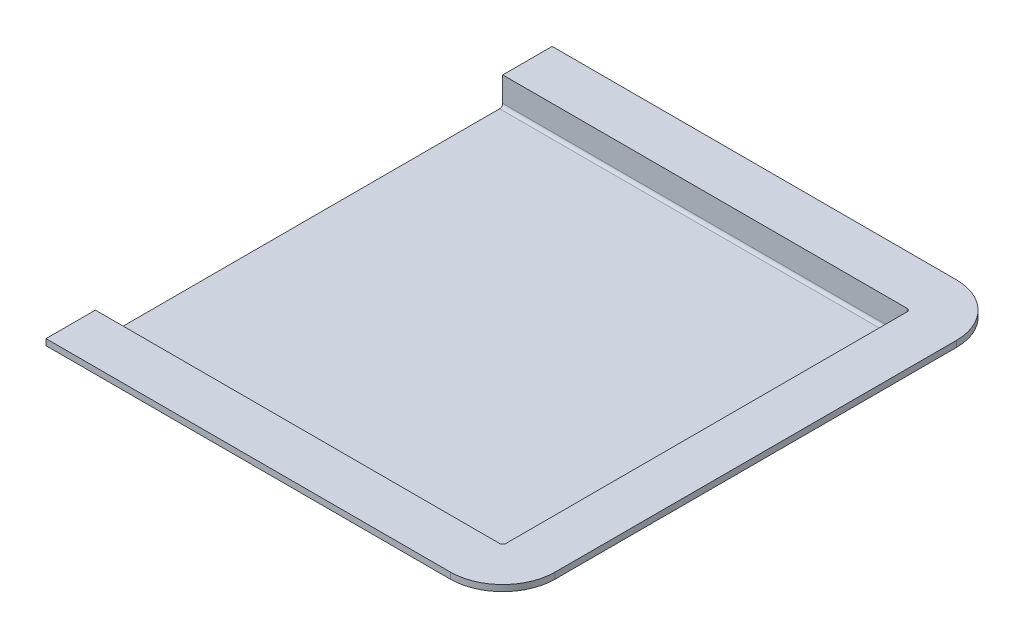
ISO-10303-21;
HEADER;
FILE_DESCRIPTION(('STEP AP214'),'2;1');
FILE_NAME('part.step','',(''),(''),'','','');
FILE_SCHEMA(('AUTOMOTIVE_DESIGN { 1 0 10303 214 1 1 1 1 }'));
ENDSEC;
DATA;
#1=APPLICATION_CONTEXT('core data for automotive mechanical design processes');
#2=APPLICATION_PROTOCOL_DEFINITION('international standard','automotive_design',2000,#1);
#3=PRODUCT_CONTEXT('',#1,'mechanical');
#4=PRODUCT('Part','Part','',(#3));
#5=PRODUCT_RELATED_PRODUCT_CATEGORY('part','',(#4));
#6=PRODUCT_DEFINITION_FORMATION('','',#4);
#7=PRODUCT_DEFINITION_CONTEXT('part definition',#1,'design');
#8=PRODUCT_DEFINITION('design','',#6,#7);
#9=PRODUCT_DEFINITION_SHAPE('','',#8);
#10=(LENGTH_UNIT() NAMED_UNIT(*) SI_UNIT(.MILLI.,.METRE.));
#11=(NAMED_UNIT(*) PLANE_ANGLE_UNIT() SI_UNIT($,.RADIAN.));
#12=(NAMED_UNIT(*) SI_UNIT($,.STERADIAN.) SOLID_ANGLE_UNIT());
#13=UNCERTAINTY_MEASURE_WITH_UNIT(LENGTH_MEASURE(1.E-05),#10,'distance_accuracy_value','');
#14=(GEOMETRIC_REPRESENTATION_CONTEXT(3) GLOBAL_UNCERTAINTY_ASSIGNED_CONTEXT((#13)) GLOBAL_UNIT_ASSIGNED_CONTEXT((#10,
#11,#12)) REPRESENTATION_CONTEXT('',''));
#15=CARTESIAN_POINT('',(0.,0.,0.));
#16=DIRECTION('',(0.,0.,1.));
#17=DIRECTION('',(1.,0.,0.));
#18=AXIS2_PLACEMENT_3D('',#15,#16,#17);
#19=CARTESIAN_POINT('',(-66.,9.,68.));
#20=DIRECTION('',(0.,0.,-1.));
#21=DIRECTION('',(-1.,0.,0.));
#22=AXIS2_PLACEMENT_3D('',#19,#20,#21);
#23=PLANE('',#22);
#24=DIRECTION('',(0.,-1.,0.));
#25=VECTOR('',#24,1.);
#26=CARTESIAN_POINT('',(65.,9.,68.));
#27=LINE('',#26,#25);
#28=CARTESIAN_POINT('',(65.,0.999999999999999,68.));
#29=VERTEX_POINT('',#28);
#30=CARTESIAN_POINT('',(65.,4.,68.));
#31=VERTEX_POINT('',#30);
#32=EDGE_CURVE('E351',#29,#31,#27,.F.);
#33=ORIENTED_EDGE('',*,*,#32,.T.);
#34=DIRECTION('',(-1.,0.,0.));
#35=VECTOR('',#34,1.);
#36=CARTESIAN_POINT('',(-66.,4.,68.));
#37=LINE('',#36,#35);
#38=CARTESIAN_POINT('',(-66.,4.,68.));
#39=VERTEX_POINT('',#38);
#40=EDGE_CURVE('E369',#31,#39,#37,.T.);
#41=ORIENTED_EDGE('',*,*,#40,.T.);
#42=DIRECTION('',(0.,-1.,0.));
#43=VECTOR('',#42,1.);
#44=CARTESIAN_POINT('',(-66.,9.,68.));
#45=LINE('',#44,#43);
#46=CARTESIAN_POINT('',(-66.,0.999999999999999,68.));
#47=VERTEX_POINT('',#46);
#48=EDGE_CURVE('E277',#39,#47,#45,.T.);
#49=ORIENTED_EDGE('',*,*,#48,.T.);
#50=DIRECTION('',(1.,0.,0.));
#51=VECTOR('',#50,1.);
#52=CARTESIAN_POINT('',(-66.,0.999999999999999,68.));
#53=LINE('',#52,#51);
#54=EDGE_CURVE('E349',#47,#29,#53,.T.);
#55=ORIENTED_EDGE('',*,*,#54,.T.);
#56=EDGE_LOOP('',(#33,#41,#49,#55));
#57=FACE_BOUND('',#56,.T.);
#58=ADVANCED_FACE('F39',(#57),#23,.F.);
#59=CARTESIAN_POINT('',(68.,9.,-66.));
#60=DIRECTION('',(-1.,0.,0.));
#61=DIRECTION('',(0.,0.,1.));
#62=AXIS2_PLACEMENT_3D('',#59,#60,#61);
#63=PLANE('',#62);
#64=DIRECTION('',(0.,-1.,0.));
#65=VECTOR('',#64,1.);
#66=CARTESIAN_POINT('',(68.,9.,-65.));
#67=LINE('',#66,#65);
#68=CARTESIAN_POINT('',(68.,0.999999999999999,-65.));
#69=VERTEX_POINT('',#68);
#70=CARTESIAN_POINT('',(68.,4.,-65.));
#71=VERTEX_POINT('',#70);
#72=EDGE_CURVE('E344',#69,#71,#67,.F.);
#73=ORIENTED_EDGE('',*,*,#72,.T.);
#74=DIRECTION('',(0.,0.,1.));
#75=VECTOR('',#74,1.);
#76=CARTESIAN_POINT('',(68.,4.,65.));
#77=LINE('',#76,#75);
#78=CARTESIAN_POINT('',(68.,4.,65.));
#79=VERTEX_POINT('',#78);
#80=EDGE_CURVE('E400',#71,#79,#77,.T.);
#81=ORIENTED_EDGE('',*,*,#80,.T.);
#82=DIRECTION('',(0.,-1.,0.));
#83=VECTOR('',#82,1.);
#84=CARTESIAN_POINT('',(68.,9.,65.));
#85=LINE('',#84,#83);
#86=CARTESIAN_POINT('',(68.,0.999999999999999,65.));
#87=VERTEX_POINT('',#86);
#88=EDGE_CURVE('E347',#79,#87,#85,.T.);
#89=ORIENTED_EDGE('',*,*,#88,.T.);
#90=DIRECTION('',(0.,0.,-1.));
#91=VECTOR('',#90,1.);
#92=CARTESIAN_POINT('',(68.,0.999999999999999,-66.));
#93=LINE('',#92,#91);
#94=EDGE_CURVE('E325',#87,#69,#93,.T.);
#95=ORIENTED_EDGE('',*,*,#94,.T.);
#96=EDGE_LOOP('',(#73,#81,#89,#95));
#97=FACE_BOUND('',#96,.T.);
#98=ADVANCED_FACE('F501',(#97),#63,.F.);
#99=CARTESIAN_POINT('',(-66.,9.,-68.));
#100=DIRECTION('',(0.,0.,1.));
#101=DIRECTION('',(1.,0.,0.));
#102=AXIS2_PLACEMENT_3D('',#99,#100,#101);
#103=PLANE('',#102);
#104=DIRECTION('',(0.,1.,0.));
#105=VECTOR('',#104,1.);
#106=CARTESIAN_POINT('',(-66.,9.,-68.));
#107=LINE('',#106,#105);
#108=CARTESIAN_POINT('',(-66.,0.999999999999999,-68.));
#109=VERTEX_POINT('',#108);
#110=CARTESIAN_POINT('',(-66.,4.,-68.));
#111=VERTEX_POINT('',#110);
#112=EDGE_CURVE('E270',#109,#111,#107,.T.);
#113=ORIENTED_EDGE('',*,*,#112,.T.);
#114=DIRECTION('',(1.,0.,0.));
#115=VECTOR('',#114,1.);
#116=CARTESIAN_POINT('',(65.,4.,-68.));
#117=LINE('',#116,#115);
#118=CARTESIAN_POINT('',(65.,4.,-68.));
#119=VERTEX_POINT('',#118);
#120=EDGE_CURVE('E61',#111,#119,#117,.T.);
#121=ORIENTED_EDGE('',*,*,#120,.T.);
#122=DIRECTION('',(0.,-1.,0.));
#123=VECTOR('',#122,1.);
#124=CARTESIAN_POINT('',(65.,9.,-68.));
#125=LINE('',#124,#123);
#126=CARTESIAN_POINT('',(65.,0.999999999999999,-68.));
#127=VERTEX_POINT('',#126);
#128=EDGE_CURVE('E356',#119,#127,#125,.T.);
#129=ORIENTED_EDGE('',*,*,#128,.T.);
#130=DIRECTION('',(-1.,0.,0.));
#131=VECTOR('',#130,1.);
#132=CARTESIAN_POINT('',(-66.,0.999999999999999,-68.));
#133=LINE('',#132,#131);
#134=EDGE_CURVE('E354',#127,#109,#133,.T.);
#135=ORIENTED_EDGE('',*,*,#134,.T.);
#136=EDGE_LOOP('',(#113,#121,#129,#135));
#137=FACE_BOUND('',#136,.T.);
#138=ADVANCED_FACE('F507',(#137),#103,.F.);
#139=CARTESIAN_POINT('',(65.,9.,-65.));
#140=DIRECTION('',(0.,-1.,0.));
#141=DIRECTION('',(0.,0.,-1.));
#142=AXIS2_PLACEMENT_3D('',#139,#140,#141);
#143=CYLINDRICAL_SURFACE('',#142,3.);
#144=ORIENTED_EDGE('',*,*,#128,.F.);
#145=CARTESIAN_POINT('',(65.,4.,-65.));
#146=DIRECTION('',(0.,1.,0.));
#147=DIRECTION('',(0.,0.,1.));
#148=AXIS2_PLACEMENT_3D('',#145,#146,#147);
#149=CIRCLE('',#148,3.);
#150=EDGE_CURVE('E402',#119,#71,#149,.F.);
#151=ORIENTED_EDGE('',*,*,#150,.T.);
#152=ORIENTED_EDGE('',*,*,#72,.F.);
#153=CARTESIAN_POINT('',(65.,0.999999999999999,-65.));
#154=DIRECTION('',(0.,-1.,0.));
#155=DIRECTION('',(0.,0.,-1.));
#156=AXIS2_PLACEMENT_3D('',#153,#154,#155);
#157=CIRCLE('',#156,3.);
#158=EDGE_CURVE('E329',#127,#69,#157,.T.);
#159=ORIENTED_EDGE('',*,*,#158,.F.);
#160=EDGE_LOOP('',(#144,#151,#152,#159));
#161=FACE_BOUND('',#160,.T.);
#162=ADVANCED_FACE('F515',(#161),#143,.T.);
#163=CARTESIAN_POINT('',(65.,9.,65.));
#164=DIRECTION('',(0.,-1.,0.));
#165=DIRECTION('',(0.,0.,-1.));
#166=AXIS2_PLACEMENT_3D('',#163,#164,#165);
#167=CYLINDRICAL_SURFACE('',#166,3.);
#168=ORIENTED_EDGE('',*,*,#88,.F.);
#169=CARTESIAN_POINT('',(65.,4.,65.));
#170=DIRECTION('',(0.,1.,0.));
#171=DIRECTION('',(0.,0.,1.));
#172=AXIS2_PLACEMENT_3D('',#169,#170,#171);
#173=CIRCLE('',#172,3.);
#174=EDGE_CURVE('E398',#79,#31,#173,.F.);
#175=ORIENTED_EDGE('',*,*,#174,.T.);
#176=ORIENTED_EDGE('',*,*,#32,.F.);
#177=CARTESIAN_POINT('',(65.,0.999999999999999,65.));
#178=DIRECTION('',(0.,-1.,0.));
#179=DIRECTION('',(0.,0.,-1.));
#180=AXIS2_PLACEMENT_3D('',#177,#178,#179);
#181=CIRCLE('',#180,3.);
#182=EDGE_CURVE('E260',#29,#87,#181,.F.);
#183=ORIENTED_EDGE('',*,*,#182,.T.);
#184=EDGE_LOOP('',(#168,#175,#176,#183));
#185=FACE_BOUND('',#184,.T.);
#186=ADVANCED_FACE('F523',(#185),#167,.T.);
#187=CARTESIAN_POINT('',(0.,9.,0.));
#188=DIRECTION('',(0.,1.,0.));
#189=DIRECTION('',(0.,0.,1.));
#190=AXIS2_PLACEMENT_3D('',#187,#188,#189);
#191=PLANE('',#190);
#192=DIRECTION('',(-1.,0.,0.));
#193=VECTOR('',#192,1.);
#194=CARTESIAN_POINT('',(65.,9.,-82.));
#195=LINE('',#194,#193);
#196=CARTESIAN_POINT('',(65.,9.,-82.));
#197=VERTEX_POINT('',#196);
#198=CARTESIAN_POINT('',(-66.,9.,-82.));
#199=VERTEX_POINT('',#198);
#200=EDGE_CURVE('E217',#197,#199,#195,.T.);
#201=ORIENTED_EDGE('',*,*,#200,.T.);
#202=DIRECTION('',(0.,0.,-1.));
#203=VECTOR('',#202,1.);
#204=CARTESIAN_POINT('',(-66.,9.,0.));
#205=LINE('',#204,#203);
#206=CARTESIAN_POINT('',(-66.,9.,-66.));
#207=VERTEX_POINT('',#206);
#208=EDGE_CURVE('E268',#207,#199,#205,.T.);
#209=ORIENTED_EDGE('',*,*,#208,.F.);
#210=DIRECTION('',(-1.,0.,0.));
#211=VECTOR('',#210,1.);
#212=CARTESIAN_POINT('',(-66.,9.,-66.));
#213=LINE('',#212,#211);
#214=CARTESIAN_POINT('',(65.,9.,-66.));
#215=VERTEX_POINT('',#214);
#216=EDGE_CURVE('E286',#215,#207,#213,.T.);
#217=ORIENTED_EDGE('',*,*,#216,.F.);
#218=CARTESIAN_POINT('',(65.,9.,-65.));
#219=DIRECTION('',(0.,1.,0.));
#220=DIRECTION('',(0.,0.,1.));
#221=AXIS2_PLACEMENT_3D('',#218,#219,#220);
#222=CIRCLE('',#221,1.);
#223=CARTESIAN_POINT('',(66.,9.,-65.));
#224=VERTEX_POINT('',#223);
#225=EDGE_CURVE('E319',#215,#224,#222,.F.);
#226=ORIENTED_EDGE('',*,*,#225,.T.);
#227=DIRECTION('',(0.,0.,-1.));
#228=VECTOR('',#227,1.);
#229=CARTESIAN_POINT('',(66.,9.,-66.));
#230=LINE('',#229,#228);
#231=CARTESIAN_POINT('',(66.,9.,65.));
#232=VERTEX_POINT('',#231);
#233=EDGE_CURVE('E282',#232,#224,#230,.T.);
#234=ORIENTED_EDGE('',*,*,#233,.F.);
#235=CARTESIAN_POINT('',(65.,9.,65.));
#236=DIRECTION('',(0.,1.,0.));
#237=DIRECTION('',(0.,0.,1.));
#238=AXIS2_PLACEMENT_3D('',#235,#236,#237);
#239=CIRCLE('',#238,1.);
#240=CARTESIAN_POINT('',(65.,9.,66.));
#241=VERTEX_POINT('',#240);
#242=EDGE_CURVE('E317',#232,#241,#239,.F.);
#243=ORIENTED_EDGE('',*,*,#242,.T.);
#244=DIRECTION('',(1.,0.,0.));
#245=VECTOR('',#244,1.);
#246=CARTESIAN_POINT('',(-66.,9.,66.));
#247=LINE('',#246,#245);
#248=CARTESIAN_POINT('',(-66.,9.,66.));
#249=VERTEX_POINT('',#248);
#250=EDGE_CURVE('E279',#249,#241,#247,.T.);
#251=ORIENTED_EDGE('',*,*,#250,.F.);
#252=CARTESIAN_POINT('',(-66.,9.,82.));
#253=VERTEX_POINT('',#252);
#254=EDGE_CURVE('E272',#253,#249,#205,.T.);
#255=ORIENTED_EDGE('',*,*,#254,.F.);
#256=DIRECTION('',(1.,0.,0.));
#257=VECTOR('',#256,1.);
#258=CARTESIAN_POINT('',(-66.,9.,82.));
#259=LINE('',#258,#257);
#260=CARTESIAN_POINT('',(65.,9.,82.));
#261=VERTEX_POINT('',#260);
#262=EDGE_CURVE('E223',#253,#261,#259,.T.);
#263=ORIENTED_EDGE('',*,*,#262,.T.);
#264=CARTESIAN_POINT('',(65.,9.,65.));
#265=DIRECTION('',(0.,1.,0.));
#266=DIRECTION('',(0.,0.,1.));
#267=AXIS2_PLACEMENT_3D('',#264,#265,#266);
#268=CIRCLE('',#267,17.);
#269=CARTESIAN_POINT('',(82.,9.,65.));
#270=VERTEX_POINT('',#269);
#271=EDGE_CURVE('E246',#261,#270,#268,.T.);
#272=ORIENTED_EDGE('',*,*,#271,.T.);
#273=DIRECTION('',(0.,0.,-1.));
#274=VECTOR('',#273,1.);
#275=CARTESIAN_POINT('',(82.,9.,65.));
#276=LINE('',#275,#274);
#277=CARTESIAN_POINT('',(82.,9.,-65.));
#278=VERTEX_POINT('',#277);
#279=EDGE_CURVE('E249',#270,#278,#276,.T.);
#280=ORIENTED_EDGE('',*,*,#279,.T.);
#281=CARTESIAN_POINT('',(65.,9.,-65.));
#282=DIRECTION('',(0.,1.,0.));
#283=DIRECTION('',(0.,0.,1.));
#284=AXIS2_PLACEMENT_3D('',#281,#282,#283);
#285=CIRCLE('',#284,17.);
#286=EDGE_CURVE('E252',#278,#197,#285,.T.);
#287=ORIENTED_EDGE('',*,*,#286,.T.);
#288=EDGE_LOOP('',(#201,#209,#217,#226,#234,#243,#251,#255,#263,#272,#280,#287));
#289=FACE_BOUND('',#288,.T.);
#290=ADVANCED_FACE('F433',(#289),#191,.T.);
#291=CARTESIAN_POINT('',(0.,-2.,0.));
#292=DIRECTION('',(0.,1.,0.));
#293=DIRECTION('',(0.,0.,1.));
#294=AXIS2_PLACEMENT_3D('',#291,#292,#293);
#295=PLANE('',#294);
#296=DIRECTION('',(0.,0.,-1.));
#297=VECTOR('',#296,1.);
#298=CARTESIAN_POINT('',(-66.,-2.,0.));
#299=LINE('',#298,#297);
#300=CARTESIAN_POINT('',(-66.,-2.,65.));
#301=VERTEX_POINT('',#300);
#302=CARTESIAN_POINT('',(-66.,-2.,-65.));
#303=VERTEX_POINT('',#302);
#304=EDGE_CURVE('E274',#301,#303,#299,.T.);
#305=ORIENTED_EDGE('',*,*,#304,.T.);
#306=DIRECTION('',(-1.,0.,0.));
#307=VECTOR('',#306,1.);
#308=CARTESIAN_POINT('',(0.,-2.,-65.));
#309=LINE('',#308,#307);
#310=CARTESIAN_POINT('',(65.,-2.,-65.));
#311=VERTEX_POINT('',#310);
#312=EDGE_CURVE('E367',#303,#311,#309,.F.);
#313=ORIENTED_EDGE('',*,*,#312,.T.);
#314=DIRECTION('',(0.,0.,-1.));
#315=VECTOR('',#314,1.);
#316=CARTESIAN_POINT('',(65.,-2.,0.));
#317=LINE('',#316,#315);
#318=CARTESIAN_POINT('',(65.,-2.,65.));
#319=VERTEX_POINT('',#318);
#320=EDGE_CURVE('E365',#311,#319,#317,.F.);
#321=ORIENTED_EDGE('',*,*,#320,.T.);
#322=DIRECTION('',(1.,0.,0.));
#323=VECTOR('',#322,1.);
#324=CARTESIAN_POINT('',(0.,-2.,65.));
#325=LINE('',#324,#323);
#326=EDGE_CURVE('E363',#319,#301,#325,.F.);
#327=ORIENTED_EDGE('',*,*,#326,.T.);
#328=EDGE_LOOP('',(#305,#313,#321,#327));
#329=FACE_BOUND('',#328,.T.);
#330=ADVANCED_FACE('F516',(#329),#295,.F.);
#331=CARTESIAN_POINT('',(-66.,9.,66.));
#332=DIRECTION('',(0.,0.,-1.));
#333=DIRECTION('',(-1.,0.,0.));
#334=AXIS2_PLACEMENT_3D('',#331,#332,#333);
#335=PLANE('',#334);
#336=ORIENTED_EDGE('',*,*,#250,.T.);
#337=DIRECTION('',(0.,-1.,0.));
#338=VECTOR('',#337,1.);
#339=CARTESIAN_POINT('',(65.,0.,66.));
#340=LINE('',#339,#338);
#341=CARTESIAN_POINT('',(65.,1.,66.));
#342=VERTEX_POINT('',#341);
#343=EDGE_CURVE('E298',#241,#342,#340,.T.);
#344=ORIENTED_EDGE('',*,*,#343,.T.);
#345=DIRECTION('',(1.,0.,0.));
#346=VECTOR('',#345,1.);
#347=CARTESIAN_POINT('',(-66.,1.,66.));
#348=LINE('',#347,#346);
#349=CARTESIAN_POINT('',(-66.,0.999999999999999,66.));
#350=VERTEX_POINT('',#349);
#351=EDGE_CURVE('E296',#342,#350,#348,.F.);
#352=ORIENTED_EDGE('',*,*,#351,.T.);
#353=DIRECTION('',(0.,-1.,0.));
#354=VECTOR('',#353,1.);
#355=CARTESIAN_POINT('',(-66.,9.,66.));
#356=LINE('',#355,#354);
#357=EDGE_CURVE('E293',#249,#350,#356,.T.);
#358=ORIENTED_EDGE('',*,*,#357,.F.);
#359=EDGE_LOOP('',(#336,#344,#352,#358));
#360=FACE_BOUND('',#359,.T.);
#361=ADVANCED_FACE('F449',(#360),#335,.T.);
#362=CARTESIAN_POINT('',(66.,9.,-66.));
#363=DIRECTION('',(-1.,0.,0.));
#364=DIRECTION('',(0.,0.,1.));
#365=AXIS2_PLACEMENT_3D('',#362,#363,#364);
#366=PLANE('',#365);
#367=DIRECTION('',(0.,0.,-1.));
#368=VECTOR('',#367,1.);
#369=CARTESIAN_POINT('',(66.,1.,66.));
#370=LINE('',#369,#368);
#371=CARTESIAN_POINT('',(66.,1.,-65.));
#372=VERTEX_POINT('',#371);
#373=CARTESIAN_POINT('',(66.,1.,65.));
#374=VERTEX_POINT('',#373);
#375=EDGE_CURVE('E301',#372,#374,#370,.F.);
#376=ORIENTED_EDGE('',*,*,#375,.T.);
#377=DIRECTION('',(0.,-1.,0.));
#378=VECTOR('',#377,1.);
#379=CARTESIAN_POINT('',(66.,9.,65.));
#380=LINE('',#379,#378);
#381=EDGE_CURVE('E305',#374,#232,#380,.F.);
#382=ORIENTED_EDGE('',*,*,#381,.T.);
#383=ORIENTED_EDGE('',*,*,#233,.T.);
#384=DIRECTION('',(0.,-1.,0.));
#385=VECTOR('',#384,1.);
#386=CARTESIAN_POINT('',(66.,0.,-65.));
#387=LINE('',#386,#385);
#388=EDGE_CURVE('E303',#224,#372,#387,.T.);
#389=ORIENTED_EDGE('',*,*,#388,.T.);
#390=EDGE_LOOP('',(#376,#382,#383,#389));
#391=FACE_BOUND('',#390,.T.);
#392=ADVANCED_FACE('F476',(#391),#366,.T.);
#393=CARTESIAN_POINT('',(-66.,9.,-66.));
#394=DIRECTION('',(0.,0.,1.));
#395=DIRECTION('',(1.,0.,0.));
#396=AXIS2_PLACEMENT_3D('',#393,#394,#395);
#397=PLANE('',#396);
#398=DIRECTION('',(-1.,0.,0.));
#399=VECTOR('',#398,1.);
#400=CARTESIAN_POINT('',(66.,1.,-66.));
#401=LINE('',#400,#399);
#402=CARTESIAN_POINT('',(-66.,0.999999999999999,-66.));
#403=VERTEX_POINT('',#402);
#404=CARTESIAN_POINT('',(65.,1.,-66.));
#405=VERTEX_POINT('',#404);
#406=EDGE_CURVE('E307',#403,#405,#401,.F.);
#407=ORIENTED_EDGE('',*,*,#406,.T.);
#408=DIRECTION('',(0.,-1.,0.));
#409=VECTOR('',#408,1.);
#410=CARTESIAN_POINT('',(65.,9.,-66.));
#411=LINE('',#410,#409);
#412=EDGE_CURVE('E309',#405,#215,#411,.F.);
#413=ORIENTED_EDGE('',*,*,#412,.T.);
#414=ORIENTED_EDGE('',*,*,#216,.T.);
#415=DIRECTION('',(0.,-1.,0.));
#416=VECTOR('',#415,1.);
#417=CARTESIAN_POINT('',(-66.,9.,-66.));
#418=LINE('',#417,#416);
#419=EDGE_CURVE('E288',#207,#403,#418,.T.);
#420=ORIENTED_EDGE('',*,*,#419,.T.);
#421=EDGE_LOOP('',(#407,#413,#414,#420));
#422=FACE_BOUND('',#421,.T.);
#423=ADVANCED_FACE('F484',(#422),#397,.T.);
#424=CARTESIAN_POINT('',(0.,0.,0.));
#425=DIRECTION('',(0.,1.,0.));
#426=DIRECTION('',(0.,0.,1.));
#427=AXIS2_PLACEMENT_3D('',#424,#425,#426);
#428=PLANE('',#427);
#429=DIRECTION('',(0.,0.,1.));
#430=VECTOR('',#429,1.);
#431=CARTESIAN_POINT('',(-66.,0.,-66.));
#432=LINE('',#431,#430);
#433=CARTESIAN_POINT('',(-66.,0.,-65.));
#434=VERTEX_POINT('',#433);
#435=CARTESIAN_POINT('',(-66.,0.,65.));
#436=VERTEX_POINT('',#435);
#437=EDGE_CURVE('E283',#434,#436,#432,.T.);
#438=ORIENTED_EDGE('',*,*,#437,.T.);
#439=DIRECTION('',(1.,0.,0.));
#440=VECTOR('',#439,1.);
#441=CARTESIAN_POINT('',(66.,0.,65.));
#442=LINE('',#441,#440);
#443=CARTESIAN_POINT('',(65.,0.,65.));
#444=VERTEX_POINT('',#443);
#445=EDGE_CURVE('E315',#436,#444,#442,.T.);
#446=ORIENTED_EDGE('',*,*,#445,.T.);
#447=DIRECTION('',(0.,0.,-1.));
#448=VECTOR('',#447,1.);
#449=CARTESIAN_POINT('',(65.,0.,-66.));
#450=LINE('',#449,#448);
#451=CARTESIAN_POINT('',(65.,0.,-65.));
#452=VERTEX_POINT('',#451);
#453=EDGE_CURVE('E313',#444,#452,#450,.T.);
#454=ORIENTED_EDGE('',*,*,#453,.T.);
#455=DIRECTION('',(-1.,0.,0.));
#456=VECTOR('',#455,1.);
#457=CARTESIAN_POINT('',(-66.,0.,-65.));
#458=LINE('',#457,#456);
#459=EDGE_CURVE('E311',#452,#434,#458,.T.);
#460=ORIENTED_EDGE('',*,*,#459,.T.);
#461=EDGE_LOOP('',(#438,#446,#454,#460));
#462=FACE_BOUND('',#461,.T.);
#463=ADVANCED_FACE('F459',(#462),#428,.T.);
#464=CARTESIAN_POINT('',(-66.,9.,-66.));
#465=DIRECTION('',(1.,0.,0.));
#466=DIRECTION('',(0.,0.,-1.));
#467=AXIS2_PLACEMENT_3D('',#464,#465,#466);
#468=PLANE('',#467);
#469=ORIENTED_EDGE('',*,*,#112,.F.);
#470=CARTESIAN_POINT('',(-66.,0.999999999999999,-65.));
#471=DIRECTION('',(1.,0.,0.));
#472=DIRECTION('',(0.,0.,-1.));
#473=AXIS2_PLACEMENT_3D('',#470,#471,#472);
#474=CIRCLE('',#473,3.);
#475=EDGE_CURVE('E361',#109,#303,#474,.F.);
#476=ORIENTED_EDGE('',*,*,#475,.T.);
#477=ORIENTED_EDGE('',*,*,#304,.F.);
#478=CARTESIAN_POINT('',(-66.,0.999999999999999,65.));
#479=DIRECTION('',(1.,0.,0.));
#480=DIRECTION('',(0.,0.,-1.));
#481=AXIS2_PLACEMENT_3D('',#478,#479,#480);
#482=CIRCLE('',#481,3.);
#483=EDGE_CURVE('E358',#301,#47,#482,.F.);
#484=ORIENTED_EDGE('',*,*,#483,.T.);
#485=ORIENTED_EDGE('',*,*,#48,.F.);
#486=CARTESIAN_POINT('',(-66.,4.,71.));
#487=DIRECTION('',(1.,0.,0.));
#488=DIRECTION('',(0.,0.,-1.));
#489=AXIS2_PLACEMENT_3D('',#486,#487,#488);
#490=CIRCLE('',#489,3.);
#491=CARTESIAN_POINT('',(-66.,7.,71.));
#492=VERTEX_POINT('',#491);
#493=EDGE_CURVE('E48',#39,#492,#490,.T.);
#494=ORIENTED_EDGE('',*,*,#493,.T.);
#495=DIRECTION('',(0.,0.,1.));
#496=VECTOR('',#495,1.);
#497=CARTESIAN_POINT('',(-66.,7.,82.));
#498=LINE('',#497,#496);
#499=CARTESIAN_POINT('',(-66.,7.,82.));
#500=VERTEX_POINT('',#499);
#501=EDGE_CURVE('E207',#492,#500,#498,.T.);
#502=ORIENTED_EDGE('',*,*,#501,.T.);
#503=DIRECTION('',(0.,1.,0.));
#504=VECTOR('',#503,1.);
#505=CARTESIAN_POINT('',(-66.,7.,82.));
#506=LINE('',#505,#504);
#507=EDGE_CURVE('E210',#500,#253,#506,.T.);
#508=ORIENTED_EDGE('',*,*,#507,.T.);
#509=ORIENTED_EDGE('',*,*,#254,.T.);
#510=ORIENTED_EDGE('',*,*,#357,.T.);
#511=CARTESIAN_POINT('',(-66.,1.,65.));
#512=DIRECTION('',(1.,0.,0.));
#513=DIRECTION('',(0.,0.,-1.));
#514=AXIS2_PLACEMENT_3D('',#511,#512,#513);
#515=CIRCLE('',#514,1.);
#516=EDGE_CURVE('E321',#350,#436,#515,.T.);
#517=ORIENTED_EDGE('',*,*,#516,.T.);
#518=ORIENTED_EDGE('',*,*,#437,.F.);
#519=CARTESIAN_POINT('',(-66.,1.,-65.));
#520=DIRECTION('',(1.,0.,0.));
#521=DIRECTION('',(0.,0.,-1.));
#522=AXIS2_PLACEMENT_3D('',#519,#520,#521);
#523=CIRCLE('',#522,1.);
#524=EDGE_CURVE('E323',#434,#403,#523,.T.);
#525=ORIENTED_EDGE('',*,*,#524,.T.);
#526=ORIENTED_EDGE('',*,*,#419,.F.);
#527=ORIENTED_EDGE('',*,*,#208,.T.);
#528=DIRECTION('',(0.,1.,0.));
#529=VECTOR('',#528,1.);
#530=CARTESIAN_POINT('',(-66.,7.,-82.));
#531=LINE('',#530,#529);
#532=CARTESIAN_POINT('',(-66.,7.,-82.));
#533=VERTEX_POINT('',#532);
#534=EDGE_CURVE('E257',#533,#199,#531,.T.);
#535=ORIENTED_EDGE('',*,*,#534,.F.);
#536=DIRECTION('',(0.,0.,1.));
#537=VECTOR('',#536,1.);
#538=CARTESIAN_POINT('',(-66.,7.,-82.));
#539=LINE('',#538,#537);
#540=CARTESIAN_POINT('',(-66.,7.,-71.));
#541=VERTEX_POINT('',#540);
#542=EDGE_CURVE('E225',#533,#541,#539,.T.);
#543=ORIENTED_EDGE('',*,*,#542,.T.);
#544=CARTESIAN_POINT('',(-66.,4.,-71.));
#545=DIRECTION('',(1.,0.,0.));
#546=DIRECTION('',(0.,0.,-1.));
#547=AXIS2_PLACEMENT_3D('',#544,#545,#546);
#548=CIRCLE('',#547,3.);
#549=EDGE_CURVE('E11',#541,#111,#548,.T.);
#550=ORIENTED_EDGE('',*,*,#549,.T.);
#551=EDGE_LOOP('',(#469,#476,#477,#484,#485,#494,#502,#508,#509,#510,#517,#518,#525,#526,#527,
#535,#543,#550));
#552=FACE_BOUND('',#551,.T.);
#553=ADVANCED_FACE('F209',(#552),#468,.F.);
#554=CARTESIAN_POINT('',(0.,1.,-65.));
#555=DIRECTION('',(1.,0.,0.));
#556=DIRECTION('',(0.,0.,-1.));
#557=AXIS2_PLACEMENT_3D('',#554,#555,#556);
#558=CYLINDRICAL_SURFACE('',#557,1.);
#559=ORIENTED_EDGE('',*,*,#524,.F.);
#560=ORIENTED_EDGE('',*,*,#459,.F.);
#561=CARTESIAN_POINT('',(65.,1.,-65.));
#562=DIRECTION('',(-1.,0.,0.));
#563=DIRECTION('',(0.,0.,1.));
#564=AXIS2_PLACEMENT_3D('',#561,#562,#563);
#565=CIRCLE('',#564,1.);
#566=EDGE_CURVE('E271',#405,#452,#565,.T.);
#567=ORIENTED_EDGE('',*,*,#566,.F.);
#568=ORIENTED_EDGE('',*,*,#406,.F.);
#569=EDGE_LOOP('',(#559,#560,#567,#568));
#570=FACE_BOUND('',#569,.T.);
#571=ADVANCED_FACE('F464',(#570),#558,.F.);
#572=CARTESIAN_POINT('',(65.,9.,-65.));
#573=DIRECTION('',(0.,1.,0.));
#574=DIRECTION('',(0.,0.,1.));
#575=AXIS2_PLACEMENT_3D('',#572,#573,#574);
#576=CYLINDRICAL_SURFACE('',#575,1.);
#577=ORIENTED_EDGE('',*,*,#225,.F.);
#578=ORIENTED_EDGE('',*,*,#412,.F.);
#579=CARTESIAN_POINT('',(65.,1.,-65.));
#580=DIRECTION('',(0.,1.,0.));
#581=DIRECTION('',(0.,0.,1.));
#582=AXIS2_PLACEMENT_3D('',#579,#580,#581);
#583=CIRCLE('',#582,1.);
#584=EDGE_CURVE('E338',#372,#405,#583,.T.);
#585=ORIENTED_EDGE('',*,*,#584,.F.);
#586=ORIENTED_EDGE('',*,*,#388,.F.);
#587=EDGE_LOOP('',(#577,#578,#585,#586));
#588=FACE_BOUND('',#587,.T.);
#589=ADVANCED_FACE('F482',(#588),#576,.F.);
#590=CARTESIAN_POINT('',(65.,1.,-65.));
#591=DIRECTION('',(0.,0.,-1.));
#592=DIRECTION('',(-1.,0.,0.));
#593=AXIS2_PLACEMENT_3D('',#590,#591,#592);
#594=SPHERICAL_SURFACE('',#593,1.);
#595=ORIENTED_EDGE('',*,*,#584,.T.);
#596=ORIENTED_EDGE('',*,*,#566,.T.);
#597=CARTESIAN_POINT('',(65.,1.,-65.));
#598=DIRECTION('',(0.,0.,1.));
#599=DIRECTION('',(1.,0.,0.));
#600=AXIS2_PLACEMENT_3D('',#597,#598,#599);
#601=CIRCLE('',#600,1.);
#602=EDGE_CURVE('E335',#372,#452,#601,.F.);
#603=ORIENTED_EDGE('',*,*,#602,.F.);
#604=EDGE_LOOP('',(#595,#596,#603));
#605=FACE_BOUND('',#604,.T.);
#606=ADVANCED_FACE('F468',(#605),#594,.F.);
#607=CARTESIAN_POINT('',(0.,1.,65.));
#608=DIRECTION('',(-1.,0.,0.));
#609=DIRECTION('',(0.,0.,1.));
#610=AXIS2_PLACEMENT_3D('',#607,#608,#609);
#611=CYLINDRICAL_SURFACE('',#610,1.);
#612=ORIENTED_EDGE('',*,*,#516,.F.);
#613=ORIENTED_EDGE('',*,*,#351,.F.);
#614=CARTESIAN_POINT('',(65.,1.,65.));
#615=DIRECTION('',(-1.,0.,0.));
#616=DIRECTION('',(0.,0.,1.));
#617=AXIS2_PLACEMENT_3D('',#614,#615,#616);
#618=CIRCLE('',#617,1.);
#619=EDGE_CURVE('E332',#444,#342,#618,.T.);
#620=ORIENTED_EDGE('',*,*,#619,.F.);
#621=ORIENTED_EDGE('',*,*,#445,.F.);
#622=EDGE_LOOP('',(#612,#613,#620,#621));
#623=FACE_BOUND('',#622,.T.);
#624=ADVANCED_FACE('F454',(#623),#611,.F.);
#625=CARTESIAN_POINT('',(65.,1.,0.));
#626=DIRECTION('',(0.,0.,1.));
#627=DIRECTION('',(1.,0.,0.));
#628=AXIS2_PLACEMENT_3D('',#625,#626,#627);
#629=CYLINDRICAL_SURFACE('',#628,1.);
#630=ORIENTED_EDGE('',*,*,#602,.T.);
#631=ORIENTED_EDGE('',*,*,#453,.F.);
#632=CARTESIAN_POINT('',(65.,1.,65.));
#633=DIRECTION('',(0.,0.,-1.));
#634=DIRECTION('',(-1.,0.,0.));
#635=AXIS2_PLACEMENT_3D('',#632,#633,#634);
#636=CIRCLE('',#635,1.);
#637=EDGE_CURVE('E328',#374,#444,#636,.T.);
#638=ORIENTED_EDGE('',*,*,#637,.F.);
#639=ORIENTED_EDGE('',*,*,#375,.F.);
#640=EDGE_LOOP('',(#630,#631,#638,#639));
#641=FACE_BOUND('',#640,.T.);
#642=ADVANCED_FACE('F472',(#641),#629,.F.);
#643=CARTESIAN_POINT('',(65.,1.,65.));
#644=DIRECTION('',(0.,-1.,0.));
#645=DIRECTION('',(0.,0.,-1.));
#646=AXIS2_PLACEMENT_3D('',#643,#644,#645);
#647=SPHERICAL_SURFACE('',#646,1.);
#648=ORIENTED_EDGE('',*,*,#637,.T.);
#649=ORIENTED_EDGE('',*,*,#619,.T.);
#650=CARTESIAN_POINT('',(65.,1.,65.));
#651=DIRECTION('',(0.,1.,0.));
#652=DIRECTION('',(0.,0.,1.));
#653=AXIS2_PLACEMENT_3D('',#650,#651,#652);
#654=CIRCLE('',#653,1.);
#655=EDGE_CURVE('E326',#374,#342,#654,.F.);
#656=ORIENTED_EDGE('',*,*,#655,.F.);
#657=EDGE_LOOP('',(#648,#649,#656));
#658=FACE_BOUND('',#657,.T.);
#659=ADVANCED_FACE('F490',(#658),#647,.F.);
#660=CARTESIAN_POINT('',(65.,9.,65.));
#661=DIRECTION('',(0.,1.,0.));
#662=DIRECTION('',(0.,0.,1.));
#663=AXIS2_PLACEMENT_3D('',#660,#661,#662);
#664=CYLINDRICAL_SURFACE('',#663,1.);
#665=ORIENTED_EDGE('',*,*,#242,.F.);
#666=ORIENTED_EDGE('',*,*,#381,.F.);
#667=ORIENTED_EDGE('',*,*,#655,.T.);
#668=ORIENTED_EDGE('',*,*,#343,.F.);
#669=EDGE_LOOP('',(#665,#666,#667,#668));
#670=FACE_BOUND('',#669,.T.);
#671=ADVANCED_FACE('F487',(#670),#664,.F.);
#672=CARTESIAN_POINT('',(-66.,0.999999999999999,-65.));
#673=DIRECTION('',(-1.,0.,0.));
#674=DIRECTION('',(0.,0.,1.));
#675=AXIS2_PLACEMENT_3D('',#672,#673,#674);
#676=CYLINDRICAL_SURFACE('',#675,3.);
#677=ORIENTED_EDGE('',*,*,#475,.F.);
#678=ORIENTED_EDGE('',*,*,#134,.F.);
#679=CARTESIAN_POINT('',(65.,1.,-65.));
#680=DIRECTION('',(1.,0.,0.));
#681=DIRECTION('',(0.,0.,-1.));
#682=AXIS2_PLACEMENT_3D('',#679,#680,#681);
#683=CIRCLE('',#682,3.);
#684=EDGE_CURVE('E381',#311,#127,#683,.T.);
#685=ORIENTED_EDGE('',*,*,#684,.F.);
#686=ORIENTED_EDGE('',*,*,#312,.F.);
#687=EDGE_LOOP('',(#677,#678,#685,#686));
#688=FACE_BOUND('',#687,.T.);
#689=ADVANCED_FACE('F497',(#688),#676,.T.);
#690=CARTESIAN_POINT('',(65.,1.,-65.));
#691=DIRECTION('',(0.,0.,-1.));
#692=DIRECTION('',(0.,1.,0.));
#693=AXIS2_PLACEMENT_3D('',#690,#691,#692);
#694=SPHERICAL_SURFACE('',#693,3.);
#695=ORIENTED_EDGE('',*,*,#684,.T.);
#696=ORIENTED_EDGE('',*,*,#158,.T.);
#697=CARTESIAN_POINT('',(65.,0.999999999999999,-65.));
#698=DIRECTION('',(0.,0.,-1.));
#699=DIRECTION('',(-1.,0.,0.));
#700=AXIS2_PLACEMENT_3D('',#697,#698,#699);
#701=CIRCLE('',#700,3.);
#702=EDGE_CURVE('E378',#311,#69,#701,.F.);
#703=ORIENTED_EDGE('',*,*,#702,.F.);
#704=EDGE_LOOP('',(#695,#696,#703));
#705=FACE_BOUND('',#704,.T.);
#706=ADVANCED_FACE('F536',(#705),#694,.T.);
#707=CARTESIAN_POINT('',(65.,0.999999999999999,-66.));
#708=DIRECTION('',(0.,0.,-1.));
#709=DIRECTION('',(-1.,0.,0.));
#710=AXIS2_PLACEMENT_3D('',#707,#708,#709);
#711=CYLINDRICAL_SURFACE('',#710,3.);
#712=ORIENTED_EDGE('',*,*,#702,.T.);
#713=ORIENTED_EDGE('',*,*,#94,.F.);
#714=CARTESIAN_POINT('',(65.,1.,65.));
#715=DIRECTION('',(0.,0.,1.));
#716=DIRECTION('',(1.,0.,0.));
#717=AXIS2_PLACEMENT_3D('',#714,#715,#716);
#718=CIRCLE('',#717,3.);
#719=EDGE_CURVE('E375',#319,#87,#718,.T.);
#720=ORIENTED_EDGE('',*,*,#719,.F.);
#721=ORIENTED_EDGE('',*,*,#320,.F.);
#722=EDGE_LOOP('',(#712,#713,#720,#721));
#723=FACE_BOUND('',#722,.T.);
#724=ADVANCED_FACE('F540',(#723),#711,.T.);
#725=CARTESIAN_POINT('',(-66.,0.999999999999999,65.));
#726=DIRECTION('',(1.,0.,0.));
#727=DIRECTION('',(0.,0.,-1.));
#728=AXIS2_PLACEMENT_3D('',#725,#726,#727);
#729=CYLINDRICAL_SURFACE('',#728,3.);
#730=ORIENTED_EDGE('',*,*,#483,.F.);
#731=ORIENTED_EDGE('',*,*,#326,.F.);
#732=CARTESIAN_POINT('',(65.,0.999999999999999,65.));
#733=DIRECTION('',(1.,0.,0.));
#734=DIRECTION('',(0.,0.,-1.));
#735=AXIS2_PLACEMENT_3D('',#732,#733,#734);
#736=CIRCLE('',#735,3.);
#737=EDGE_CURVE('E372',#29,#319,#736,.T.);
#738=ORIENTED_EDGE('',*,*,#737,.F.);
#739=ORIENTED_EDGE('',*,*,#54,.F.);
#740=EDGE_LOOP('',(#730,#731,#738,#739));
#741=FACE_BOUND('',#740,.T.);
#742=ADVANCED_FACE('F543',(#741),#729,.T.);
#743=CARTESIAN_POINT('',(65.,1.,65.));
#744=DIRECTION('',(0.,-1.,0.));
#745=DIRECTION('',(0.,0.,-1.));
#746=AXIS2_PLACEMENT_3D('',#743,#744,#745);
#747=SPHERICAL_SURFACE('',#746,3.);
#748=ORIENTED_EDGE('',*,*,#737,.T.);
#749=ORIENTED_EDGE('',*,*,#719,.T.);
#750=ORIENTED_EDGE('',*,*,#182,.F.);
#751=EDGE_LOOP('',(#748,#749,#750));
#752=FACE_BOUND('',#751,.T.);
#753=ADVANCED_FACE('F561',(#752),#747,.T.);
#754=CARTESIAN_POINT('',(65.,7.,-82.));
#755=DIRECTION('',(0.,0.,-1.));
#756=DIRECTION('',(-1.,0.,0.));
#757=AXIS2_PLACEMENT_3D('',#754,#755,#756);
#758=PLANE('',#757);
#759=ORIENTED_EDGE('',*,*,#200,.F.);
#760=DIRECTION('',(0.,1.,0.));
#761=VECTOR('',#760,1.);
#762=CARTESIAN_POINT('',(65.,7.,-82.));
#763=LINE('',#762,#761);
#764=CARTESIAN_POINT('',(65.,7.,-82.));
#765=VERTEX_POINT('',#764);
#766=EDGE_CURVE('E261',#765,#197,#763,.T.);
#767=ORIENTED_EDGE('',*,*,#766,.F.);
#768=DIRECTION('',(-1.,0.,0.));
#769=VECTOR('',#768,1.);
#770=CARTESIAN_POINT('',(65.,7.,-82.));
#771=LINE('',#770,#769);
#772=EDGE_CURVE('E241',#765,#533,#771,.T.);
#773=ORIENTED_EDGE('',*,*,#772,.T.);
#774=ORIENTED_EDGE('',*,*,#534,.T.);
#775=EDGE_LOOP('',(#759,#767,#773,#774));
#776=FACE_BOUND('',#775,.T.);
#777=ADVANCED_FACE('F431',(#776),#758,.T.);
#778=CARTESIAN_POINT('',(65.,7.,-65.));
#779=DIRECTION('',(0.,1.,0.));
#780=DIRECTION('',(0.,0.,1.));
#781=AXIS2_PLACEMENT_3D('',#778,#779,#780);
#782=CYLINDRICAL_SURFACE('',#781,17.);
#783=ORIENTED_EDGE('',*,*,#286,.F.);
#784=DIRECTION('',(0.,1.,0.));
#785=VECTOR('',#784,1.);
#786=CARTESIAN_POINT('',(82.,7.,-65.));
#787=LINE('',#786,#785);
#788=CARTESIAN_POINT('',(82.,7.,-65.));
#789=VERTEX_POINT('',#788);
#790=EDGE_CURVE('E263',#789,#278,#787,.T.);
#791=ORIENTED_EDGE('',*,*,#790,.F.);
#792=CARTESIAN_POINT('',(65.,7.,-65.));
#793=DIRECTION('',(0.,1.,0.));
#794=DIRECTION('',(0.,0.,1.));
#795=AXIS2_PLACEMENT_3D('',#792,#793,#794);
#796=CIRCLE('',#795,17.);
#797=EDGE_CURVE('E238',#789,#765,#796,.T.);
#798=ORIENTED_EDGE('',*,*,#797,.T.);
#799=ORIENTED_EDGE('',*,*,#766,.T.);
#800=EDGE_LOOP('',(#783,#791,#798,#799));
#801=FACE_BOUND('',#800,.T.);
#802=ADVANCED_FACE('F438',(#801),#782,.T.);
#803=CARTESIAN_POINT('',(82.,7.,65.));
#804=DIRECTION('',(1.,0.,0.));
#805=DIRECTION('',(0.,0.,-1.));
#806=AXIS2_PLACEMENT_3D('',#803,#804,#805);
#807=PLANE('',#806);
#808=ORIENTED_EDGE('',*,*,#279,.F.);
#809=DIRECTION('',(0.,1.,0.));
#810=VECTOR('',#809,1.);
#811=CARTESIAN_POINT('',(82.,7.,65.));
#812=LINE('',#811,#810);
#813=CARTESIAN_POINT('',(82.,7.,65.));
#814=VERTEX_POINT('',#813);
#815=EDGE_CURVE('E265',#814,#270,#812,.T.);
#816=ORIENTED_EDGE('',*,*,#815,.F.);
#817=DIRECTION('',(0.,0.,-1.));
#818=VECTOR('',#817,1.);
#819=CARTESIAN_POINT('',(82.,7.,65.));
#820=LINE('',#819,#818);
#821=EDGE_CURVE('E233',#814,#789,#820,.T.);
#822=ORIENTED_EDGE('',*,*,#821,.T.);
#823=ORIENTED_EDGE('',*,*,#790,.T.);
#824=EDGE_LOOP('',(#808,#816,#822,#823));
#825=FACE_BOUND('',#824,.T.);
#826=ADVANCED_FACE('F441',(#825),#807,.T.);
#827=CARTESIAN_POINT('',(65.,7.,65.));
#828=DIRECTION('',(0.,1.,0.));
#829=DIRECTION('',(0.,0.,1.));
#830=AXIS2_PLACEMENT_3D('',#827,#828,#829);
#831=CYLINDRICAL_SURFACE('',#830,17.);
#832=ORIENTED_EDGE('',*,*,#271,.F.);
#833=DIRECTION('',(0.,1.,0.));
#834=VECTOR('',#833,1.);
#835=CARTESIAN_POINT('',(65.,7.,82.));
#836=LINE('',#835,#834);
#837=CARTESIAN_POINT('',(65.,7.,82.));
#838=VERTEX_POINT('',#837);
#839=EDGE_CURVE('E224',#838,#261,#836,.T.);
#840=ORIENTED_EDGE('',*,*,#839,.F.);
#841=CARTESIAN_POINT('',(65.,7.,65.));
#842=DIRECTION('',(0.,1.,0.));
#843=DIRECTION('',(0.,0.,1.));
#844=AXIS2_PLACEMENT_3D('',#841,#842,#843);
#845=CIRCLE('',#844,17.);
#846=EDGE_CURVE('E231',#838,#814,#845,.T.);
#847=ORIENTED_EDGE('',*,*,#846,.T.);
#848=ORIENTED_EDGE('',*,*,#815,.T.);
#849=EDGE_LOOP('',(#832,#840,#847,#848));
#850=FACE_BOUND('',#849,.T.);
#851=ADVANCED_FACE('F444',(#850),#831,.T.);
#852=CARTESIAN_POINT('',(-66.,7.,82.));
#853=DIRECTION('',(0.,0.,1.));
#854=DIRECTION('',(1.,0.,0.));
#855=AXIS2_PLACEMENT_3D('',#852,#853,#854);
#856=PLANE('',#855);
#857=ORIENTED_EDGE('',*,*,#262,.F.);
#858=ORIENTED_EDGE('',*,*,#507,.F.);
#859=DIRECTION('',(1.,0.,0.));
#860=VECTOR('',#859,1.);
#861=CARTESIAN_POINT('',(-66.,7.,82.));
#862=LINE('',#861,#860);
#863=EDGE_CURVE('E216',#500,#838,#862,.T.);
#864=ORIENTED_EDGE('',*,*,#863,.T.);
#865=ORIENTED_EDGE('',*,*,#839,.T.);
#866=EDGE_LOOP('',(#857,#858,#864,#865));
#867=FACE_BOUND('',#866,.T.);
#868=ADVANCED_FACE('F221',(#867),#856,.T.);
#869=CARTESIAN_POINT('',(65.,7.,65.));
#870=DIRECTION('',(0.,1.,0.));
#871=DIRECTION('',(0.,0.,1.));
#872=AXIS2_PLACEMENT_3D('',#869,#870,#871);
#873=PLANE('',#872);
#874=ORIENTED_EDGE('',*,*,#501,.F.);
#875=DIRECTION('',(-1.,0.,0.));
#876=VECTOR('',#875,1.);
#877=CARTESIAN_POINT('',(65.,7.,71.));
#878=LINE('',#877,#876);
#879=CARTESIAN_POINT('',(65.,7.,71.));
#880=VERTEX_POINT('',#879);
#881=EDGE_CURVE('E396',#492,#880,#878,.F.);
#882=ORIENTED_EDGE('',*,*,#881,.T.);
#883=CARTESIAN_POINT('',(65.,7.,65.));
#884=DIRECTION('',(0.,1.,0.));
#885=DIRECTION('',(0.,0.,1.));
#886=AXIS2_PLACEMENT_3D('',#883,#884,#885);
#887=CIRCLE('',#886,6.);
#888=CARTESIAN_POINT('',(71.,7.,65.));
#889=VERTEX_POINT('',#888);
#890=EDGE_CURVE('E394',#880,#889,#887,.T.);
#891=ORIENTED_EDGE('',*,*,#890,.T.);
#892=DIRECTION('',(0.,0.,1.));
#893=VECTOR('',#892,1.);
#894=CARTESIAN_POINT('',(71.,7.,-65.));
#895=LINE('',#894,#893);
#896=CARTESIAN_POINT('',(71.,7.,-65.));
#897=VERTEX_POINT('',#896);
#898=EDGE_CURVE('E392',#889,#897,#895,.F.);
#899=ORIENTED_EDGE('',*,*,#898,.T.);
#900=CARTESIAN_POINT('',(65.,7.,-65.));
#901=DIRECTION('',(0.,1.,0.));
#902=DIRECTION('',(0.,0.,1.));
#903=AXIS2_PLACEMENT_3D('',#900,#901,#902);
#904=CIRCLE('',#903,6.);
#905=CARTESIAN_POINT('',(65.,7.,-71.));
#906=VERTEX_POINT('',#905);
#907=EDGE_CURVE('E390',#897,#906,#904,.T.);
#908=ORIENTED_EDGE('',*,*,#907,.T.);
#909=DIRECTION('',(1.,0.,0.));
#910=VECTOR('',#909,1.);
#911=CARTESIAN_POINT('',(-66.,7.,-71.));
#912=LINE('',#911,#910);
#913=EDGE_CURVE('E388',#906,#541,#912,.F.);
#914=ORIENTED_EDGE('',*,*,#913,.T.);
#915=ORIENTED_EDGE('',*,*,#542,.F.);
#916=ORIENTED_EDGE('',*,*,#772,.F.);
#917=ORIENTED_EDGE('',*,*,#797,.F.);
#918=ORIENTED_EDGE('',*,*,#821,.F.);
#919=ORIENTED_EDGE('',*,*,#846,.F.);
#920=ORIENTED_EDGE('',*,*,#863,.F.);
#921=EDGE_LOOP('',(#874,#882,#891,#899,#908,#914,#915,#916,#917,#918,#919,#920));
#922=FACE_BOUND('',#921,.T.);
#923=ADVANCED_FACE('F228',(#922),#873,.F.);
#924=CARTESIAN_POINT('',(-66.,4.,-71.));
#925=DIRECTION('',(-1.,0.,0.));
#926=DIRECTION('',(0.,0.,1.));
#927=AXIS2_PLACEMENT_3D('',#924,#925,#926);
#928=CYLINDRICAL_SURFACE('',#927,3.);
#929=ORIENTED_EDGE('',*,*,#549,.F.);
#930=ORIENTED_EDGE('',*,*,#913,.F.);
#931=CARTESIAN_POINT('',(65.,4.,-71.));
#932=DIRECTION('',(-1.,0.,0.));
#933=DIRECTION('',(0.,0.,1.));
#934=AXIS2_PLACEMENT_3D('',#931,#932,#933);
#935=CIRCLE('',#934,3.);
#936=EDGE_CURVE('E43',#119,#906,#935,.T.);
#937=ORIENTED_EDGE('',*,*,#936,.F.);
#938=ORIENTED_EDGE('',*,*,#120,.F.);
#939=EDGE_LOOP('',(#929,#930,#937,#938));
#940=FACE_BOUND('',#939,.T.);
#941=ADVANCED_FACE('F41',(#940),#928,.F.);
#942=CARTESIAN_POINT('',(65.,4.,-65.));
#943=DIRECTION('',(0.,1.,0.));
#944=DIRECTION('',(0.,0.,1.));
#945=AXIS2_PLACEMENT_3D('',#942,#943,#944);
#946=TOROIDAL_SURFACE('',#945,6.,3.);
#947=ORIENTED_EDGE('',*,*,#936,.T.);
#948=ORIENTED_EDGE('',*,*,#907,.F.);
#949=CARTESIAN_POINT('',(71.,4.,-65.));
#950=DIRECTION('',(0.,0.,-1.));
#951=DIRECTION('',(-1.,0.,0.));
#952=AXIS2_PLACEMENT_3D('',#949,#950,#951);
#953=CIRCLE('',#952,3.);
#954=EDGE_CURVE('E411',#71,#897,#953,.T.);
#955=ORIENTED_EDGE('',*,*,#954,.F.);
#956=ORIENTED_EDGE('',*,*,#150,.F.);
#957=EDGE_LOOP('',(#947,#948,#955,#956));
#958=FACE_BOUND('',#957,.T.);
#959=ADVANCED_FACE('F422',(#958),#946,.F.);
#960=CARTESIAN_POINT('',(71.,4.,-66.));
#961=DIRECTION('',(0.,0.,-1.));
#962=DIRECTION('',(-1.,0.,0.));
#963=AXIS2_PLACEMENT_3D('',#960,#961,#962);
#964=CYLINDRICAL_SURFACE('',#963,3.);
#965=ORIENTED_EDGE('',*,*,#954,.T.);
#966=ORIENTED_EDGE('',*,*,#898,.F.);
#967=CARTESIAN_POINT('',(71.,4.,65.));
#968=DIRECTION('',(0.,0.,-1.));
#969=DIRECTION('',(-1.,0.,0.));
#970=AXIS2_PLACEMENT_3D('',#967,#968,#969);
#971=CIRCLE('',#970,3.);
#972=EDGE_CURVE('E409',#79,#889,#971,.T.);
#973=ORIENTED_EDGE('',*,*,#972,.F.);
#974=ORIENTED_EDGE('',*,*,#80,.F.);
#975=EDGE_LOOP('',(#965,#966,#973,#974));
#976=FACE_BOUND('',#975,.T.);
#977=ADVANCED_FACE('F555',(#976),#964,.F.);
#978=CARTESIAN_POINT('',(65.,4.,65.));
#979=DIRECTION('',(0.,1.,0.));
#980=DIRECTION('',(0.,0.,1.));
#981=AXIS2_PLACEMENT_3D('',#978,#979,#980);
#982=TOROIDAL_SURFACE('',#981,6.,3.);
#983=ORIENTED_EDGE('',*,*,#972,.T.);
#984=ORIENTED_EDGE('',*,*,#890,.F.);
#985=CARTESIAN_POINT('',(65.,4.,71.));
#986=DIRECTION('',(1.,0.,0.));
#987=DIRECTION('',(0.,0.,-1.));
#988=AXIS2_PLACEMENT_3D('',#985,#986,#987);
#989=CIRCLE('',#988,3.);
#990=EDGE_CURVE('E406',#31,#880,#989,.T.);
#991=ORIENTED_EDGE('',*,*,#990,.F.);
#992=ORIENTED_EDGE('',*,*,#174,.F.);
#993=EDGE_LOOP('',(#983,#984,#991,#992));
#994=FACE_BOUND('',#993,.T.);
#995=ADVANCED_FACE('F552',(#994),#982,.F.);
#996=CARTESIAN_POINT('',(-66.,4.,71.));
#997=DIRECTION('',(1.,0.,0.));
#998=DIRECTION('',(0.,0.,-1.));
#999=AXIS2_PLACEMENT_3D('',#996,#997,#998);
#1000=CYLINDRICAL_SURFACE('',#999,3.);
#1001=ORIENTED_EDGE('',*,*,#990,.T.);
#1002=ORIENTED_EDGE('',*,*,#881,.F.);
#1003=ORIENTED_EDGE('',*,*,#493,.F.);
#1004=ORIENTED_EDGE('',*,*,#40,.F.);
#1005=EDGE_LOOP('',(#1001,#1002,#1003,#1004));
#1006=FACE_BOUND('',#1005,.T.);
#1007=ADVANCED_FACE('F549',(#1006),#1000,.F.);
#1008=CLOSED_SHELL('',(#58,#98,#138,#162,#186,#290,#330,#361,#392,#423,#463,#553,#571,#589,#606,
#624,#642,#659,#671,#689,#706,#724,#742,#753,#777,#802,#826,#851,#868,#923,#941,#959,#977,#995,#1007));
#1009=MANIFOLD_SOLID_BREP('B2',#1008);
#1010=ADVANCED_BREP_SHAPE_REPRESENTATION('',(#18,#1009),#14);
#1011=SHAPE_DEFINITION_REPRESENTATION(#9,#1010);
ENDSEC;
END-ISO-10303-21;
